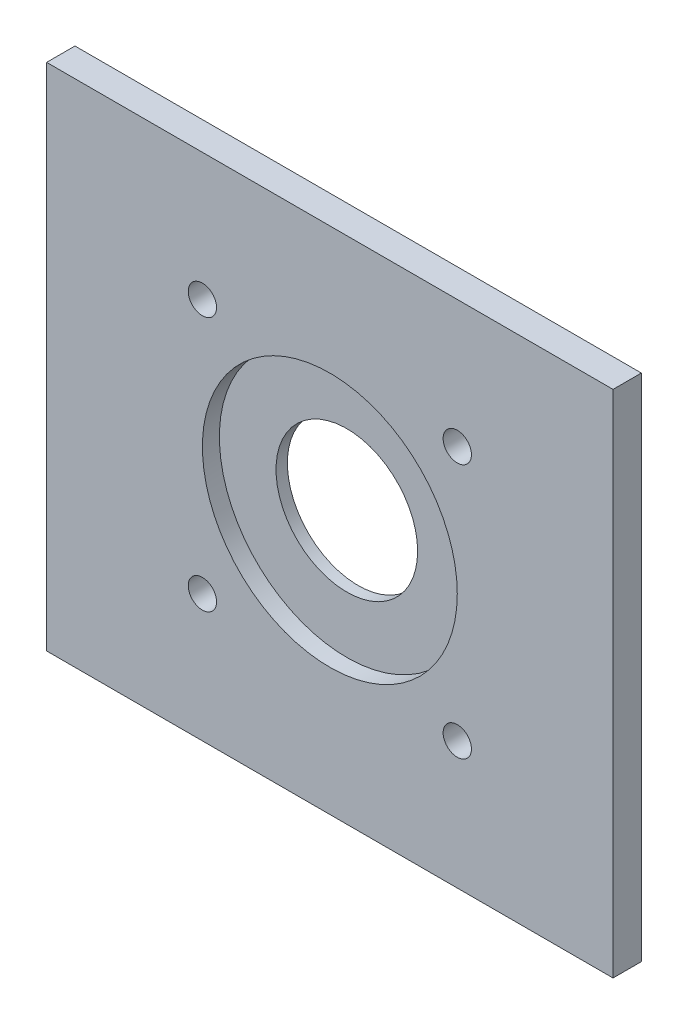
ISO-10303-21;
HEADER;
FILE_DESCRIPTION(('STEP AP214'),'2;1');
FILE_NAME('part.step','',(''),(''),'','','');
FILE_SCHEMA(('AUTOMOTIVE_DESIGN { 1 0 10303 214 1 1 1 1 }'));
ENDSEC;
DATA;
#1=APPLICATION_CONTEXT('core data for automotive mechanical design processes');
#2=APPLICATION_PROTOCOL_DEFINITION('international standard','automotive_design',2000,#1);
#3=PRODUCT_CONTEXT('',#1,'mechanical');
#4=PRODUCT('Part','Part','',(#3));
#5=PRODUCT_RELATED_PRODUCT_CATEGORY('part','',(#4));
#6=PRODUCT_DEFINITION_FORMATION('','',#4);
#7=PRODUCT_DEFINITION_CONTEXT('part definition',#1,'design');
#8=PRODUCT_DEFINITION('design','',#6,#7);
#9=PRODUCT_DEFINITION_SHAPE('','',#8);
#10=(LENGTH_UNIT() NAMED_UNIT(*) SI_UNIT(.MILLI.,.METRE.));
#11=(NAMED_UNIT(*) PLANE_ANGLE_UNIT() SI_UNIT($,.RADIAN.));
#12=(NAMED_UNIT(*) SI_UNIT($,.STERADIAN.) SOLID_ANGLE_UNIT());
#13=UNCERTAINTY_MEASURE_WITH_UNIT(LENGTH_MEASURE(1.E-05),#10,'distance_accuracy_value','');
#14=(GEOMETRIC_REPRESENTATION_CONTEXT(3) GLOBAL_UNCERTAINTY_ASSIGNED_CONTEXT((#13)) GLOBAL_UNIT_ASSIGNED_CONTEXT((#10,
#11,#12)) REPRESENTATION_CONTEXT('',''));
#15=CARTESIAN_POINT('',(0.,0.,0.));
#16=DIRECTION('',(0.,0.,1.));
#17=DIRECTION('',(1.,0.,0.));
#18=AXIS2_PLACEMENT_3D('',#15,#16,#17);
#19=CARTESIAN_POINT('',(50.,45.,5.));
#20=DIRECTION('',(0.,0.,-1.));
#21=DIRECTION('',(-1.,0.,0.));
#22=AXIS2_PLACEMENT_3D('',#19,#20,#21);
#23=CYLINDRICAL_SURFACE('',#22,12.5);
#24=CARTESIAN_POINT('',(50.,45.,0.));
#25=DIRECTION('',(0.,0.,1.));
#26=DIRECTION('',(1.,0.,0.));
#27=AXIS2_PLACEMENT_3D('',#24,#25,#26);
#28=CIRCLE('',#27,12.5);
#29=CARTESIAN_POINT('',(62.5,45.,0.));
#30=VERTEX_POINT('',#29);
#31=EDGE_CURVE('E140',#30,#30,#28,.T.);
#32=ORIENTED_EDGE('',*,*,#31,.F.);
#33=EDGE_LOOP('',(#32));
#34=FACE_BOUND('',#33,.T.);
#35=CARTESIAN_POINT('',(50.,45.,2.));
#36=DIRECTION('',(0.,0.,1.));
#37=DIRECTION('',(1.,0.,0.));
#38=AXIS2_PLACEMENT_3D('',#35,#36,#37);
#39=CIRCLE('',#38,12.5);
#40=CARTESIAN_POINT('',(62.5,45.,2.));
#41=VERTEX_POINT('',#40);
#42=EDGE_CURVE('E41',#41,#41,#39,.T.);
#43=ORIENTED_EDGE('',*,*,#42,.T.);
#44=EDGE_LOOP('',(#43));
#45=FACE_BOUND('',#44,.T.);
#46=ADVANCED_FACE('F37',(#34,#45),#23,.F.);
#47=CARTESIAN_POINT('',(0.,0.,5.));
#48=DIRECTION('',(0.,0.,-1.));
#49=DIRECTION('',(-1.,0.,0.));
#50=AXIS2_PLACEMENT_3D('',#47,#48,#49);
#51=PLANE('',#50);
#52=CARTESIAN_POINT('',(50.,45.,5.));
#53=DIRECTION('',(0.,0.,1.));
#54=DIRECTION('',(1.,0.,0.));
#55=AXIS2_PLACEMENT_3D('',#52,#53,#54);
#56=CIRCLE('',#55,22.5);
#57=CARTESIAN_POINT('',(72.5,45.,5.));
#58=VERTEX_POINT('',#57);
#59=EDGE_CURVE('E145',#58,#58,#56,.T.);
#60=ORIENTED_EDGE('',*,*,#59,.F.);
#61=EDGE_LOOP('',(#60));
#62=FACE_BOUND('',#61,.T.);
#63=DIRECTION('',(0.,-1.,0.));
#64=VECTOR('',#63,1.);
#65=CARTESIAN_POINT('',(0.,0.,5.));
#66=LINE('',#65,#64);
#67=CARTESIAN_POINT('',(0.,90.,5.));
#68=VERTEX_POINT('',#67);
#69=CARTESIAN_POINT('',(0.,0.,5.));
#70=VERTEX_POINT('',#69);
#71=EDGE_CURVE('E91',#68,#70,#66,.T.);
#72=ORIENTED_EDGE('',*,*,#71,.T.);
#73=DIRECTION('',(1.,0.,0.));
#74=VECTOR('',#73,1.);
#75=CARTESIAN_POINT('',(0.,0.,5.));
#76=LINE('',#75,#74);
#77=CARTESIAN_POINT('',(100.,0.,5.));
#78=VERTEX_POINT('',#77);
#79=EDGE_CURVE('E85',#70,#78,#76,.T.);
#80=ORIENTED_EDGE('',*,*,#79,.T.);
#81=DIRECTION('',(0.,1.,0.));
#82=VECTOR('',#81,1.);
#83=CARTESIAN_POINT('',(100.,0.,5.));
#84=LINE('',#83,#82);
#85=CARTESIAN_POINT('',(100.,90.,5.));
#86=VERTEX_POINT('',#85);
#87=EDGE_CURVE('E89',#78,#86,#84,.T.);
#88=ORIENTED_EDGE('',*,*,#87,.T.);
#89=DIRECTION('',(-1.,0.,0.));
#90=VECTOR('',#89,1.);
#91=CARTESIAN_POINT('',(0.,90.,5.));
#92=LINE('',#91,#90);
#93=EDGE_CURVE('E55',#86,#68,#92,.T.);
#94=ORIENTED_EDGE('',*,*,#93,.T.);
#95=EDGE_LOOP('',(#72,#80,#88,#94));
#96=FACE_BOUND('',#95,.T.);
#97=CARTESIAN_POINT('',(27.5,67.5,5.));
#98=DIRECTION('',(0.,0.,1.));
#99=DIRECTION('',(1.,0.,0.));
#100=AXIS2_PLACEMENT_3D('',#97,#98,#99);
#101=CIRCLE('',#100,2.5);
#102=CARTESIAN_POINT('',(30.,67.5,5.));
#103=VERTEX_POINT('',#102);
#104=EDGE_CURVE('E107',#103,#103,#101,.T.);
#105=ORIENTED_EDGE('',*,*,#104,.F.);
#106=EDGE_LOOP('',(#105));
#107=FACE_BOUND('',#106,.T.);
#108=CARTESIAN_POINT('',(72.5,67.5,5.));
#109=DIRECTION('',(0.,0.,1.));
#110=DIRECTION('',(1.,0.,0.));
#111=AXIS2_PLACEMENT_3D('',#108,#109,#110);
#112=CIRCLE('',#111,2.50000000000001);
#113=CARTESIAN_POINT('',(75.,67.5,5.));
#114=VERTEX_POINT('',#113);
#115=EDGE_CURVE('E122',#114,#114,#112,.T.);
#116=ORIENTED_EDGE('',*,*,#115,.F.);
#117=EDGE_LOOP('',(#116));
#118=FACE_BOUND('',#117,.T.);
#119=CARTESIAN_POINT('',(72.5,22.5,5.));
#120=DIRECTION('',(0.,0.,1.));
#121=DIRECTION('',(1.,0.,0.));
#122=AXIS2_PLACEMENT_3D('',#119,#120,#121);
#123=CIRCLE('',#122,2.50000000000001);
#124=CARTESIAN_POINT('',(75.,22.5,5.));
#125=VERTEX_POINT('',#124);
#126=EDGE_CURVE('E128',#125,#125,#123,.T.);
#127=ORIENTED_EDGE('',*,*,#126,.F.);
#128=EDGE_LOOP('',(#127));
#129=FACE_BOUND('',#128,.T.);
#130=CARTESIAN_POINT('',(27.5,22.5,5.));
#131=DIRECTION('',(0.,0.,1.));
#132=DIRECTION('',(1.,0.,0.));
#133=AXIS2_PLACEMENT_3D('',#130,#131,#132);
#134=CIRCLE('',#133,2.5);
#135=CARTESIAN_POINT('',(30.,22.5,5.));
#136=VERTEX_POINT('',#135);
#137=EDGE_CURVE('E134',#136,#136,#134,.T.);
#138=ORIENTED_EDGE('',*,*,#137,.F.);
#139=EDGE_LOOP('',(#138));
#140=FACE_BOUND('',#139,.T.);
#141=ADVANCED_FACE('F86',(#62,#96,#107,#118,#129,#140),#51,.F.);
#142=CARTESIAN_POINT('',(0.,0.,0.));
#143=DIRECTION('',(0.,0.,-1.));
#144=DIRECTION('',(-1.,0.,0.));
#145=AXIS2_PLACEMENT_3D('',#142,#143,#144);
#146=PLANE('',#145);
#147=CARTESIAN_POINT('',(27.5,22.5,0.));
#148=DIRECTION('',(0.,0.,1.));
#149=DIRECTION('',(1.,0.,0.));
#150=AXIS2_PLACEMENT_3D('',#147,#148,#149);
#151=CIRCLE('',#150,2.5);
#152=CARTESIAN_POINT('',(30.,22.5,0.));
#153=VERTEX_POINT('',#152);
#154=EDGE_CURVE('E137',#153,#153,#151,.T.);
#155=ORIENTED_EDGE('',*,*,#154,.T.);
#156=EDGE_LOOP('',(#155));
#157=FACE_BOUND('',#156,.T.);
#158=CARTESIAN_POINT('',(72.5,67.5,0.));
#159=DIRECTION('',(0.,0.,1.));
#160=DIRECTION('',(1.,0.,0.));
#161=AXIS2_PLACEMENT_3D('',#158,#159,#160);
#162=CIRCLE('',#161,2.50000000000001);
#163=CARTESIAN_POINT('',(75.,67.5,0.));
#164=VERTEX_POINT('',#163);
#165=EDGE_CURVE('E125',#164,#164,#162,.T.);
#166=ORIENTED_EDGE('',*,*,#165,.T.);
#167=EDGE_LOOP('',(#166));
#168=FACE_BOUND('',#167,.T.);
#169=DIRECTION('',(0.,-1.,0.));
#170=VECTOR('',#169,1.);
#171=CARTESIAN_POINT('',(0.,0.,0.));
#172=LINE('',#171,#170);
#173=CARTESIAN_POINT('',(0.,90.,0.));
#174=VERTEX_POINT('',#173);
#175=CARTESIAN_POINT('',(0.,0.,0.));
#176=VERTEX_POINT('',#175);
#177=EDGE_CURVE('E104',#174,#176,#172,.T.);
#178=ORIENTED_EDGE('',*,*,#177,.F.);
#179=DIRECTION('',(-1.,0.,0.));
#180=VECTOR('',#179,1.);
#181=CARTESIAN_POINT('',(0.,90.,0.));
#182=LINE('',#181,#180);
#183=CARTESIAN_POINT('',(100.,90.,0.));
#184=VERTEX_POINT('',#183);
#185=EDGE_CURVE('E78',#184,#174,#182,.T.);
#186=ORIENTED_EDGE('',*,*,#185,.F.);
#187=DIRECTION('',(0.,1.,0.));
#188=VECTOR('',#187,1.);
#189=CARTESIAN_POINT('',(100.,0.,0.));
#190=LINE('',#189,#188);
#191=CARTESIAN_POINT('',(100.,0.,0.));
#192=VERTEX_POINT('',#191);
#193=EDGE_CURVE('E72',#192,#184,#190,.T.);
#194=ORIENTED_EDGE('',*,*,#193,.F.);
#195=DIRECTION('',(1.,0.,0.));
#196=VECTOR('',#195,1.);
#197=CARTESIAN_POINT('',(0.,0.,0.));
#198=LINE('',#197,#196);
#199=EDGE_CURVE('E95',#176,#192,#198,.T.);
#200=ORIENTED_EDGE('',*,*,#199,.F.);
#201=EDGE_LOOP('',(#178,#186,#194,#200));
#202=FACE_BOUND('',#201,.T.);
#203=CARTESIAN_POINT('',(27.5,67.5,0.));
#204=DIRECTION('',(0.,0.,1.));
#205=DIRECTION('',(1.,0.,0.));
#206=AXIS2_PLACEMENT_3D('',#203,#204,#205);
#207=CIRCLE('',#206,2.5);
#208=CARTESIAN_POINT('',(30.,67.5,0.));
#209=VERTEX_POINT('',#208);
#210=EDGE_CURVE('E119',#209,#209,#207,.T.);
#211=ORIENTED_EDGE('',*,*,#210,.T.);
#212=EDGE_LOOP('',(#211));
#213=FACE_BOUND('',#212,.T.);
#214=CARTESIAN_POINT('',(72.5,22.5,0.));
#215=DIRECTION('',(0.,0.,1.));
#216=DIRECTION('',(1.,0.,0.));
#217=AXIS2_PLACEMENT_3D('',#214,#215,#216);
#218=CIRCLE('',#217,2.50000000000001);
#219=CARTESIAN_POINT('',(75.,22.5,0.));
#220=VERTEX_POINT('',#219);
#221=EDGE_CURVE('E131',#220,#220,#218,.T.);
#222=ORIENTED_EDGE('',*,*,#221,.T.);
#223=EDGE_LOOP('',(#222));
#224=FACE_BOUND('',#223,.T.);
#225=ORIENTED_EDGE('',*,*,#31,.T.);
#226=EDGE_LOOP('',(#225));
#227=FACE_BOUND('',#226,.T.);
#228=ADVANCED_FACE('F115',(#157,#168,#202,#213,#224,#227),#146,.T.);
#229=CARTESIAN_POINT('',(0.,0.,5.));
#230=DIRECTION('',(1.,0.,0.));
#231=DIRECTION('',(0.,0.,-1.));
#232=AXIS2_PLACEMENT_3D('',#229,#230,#231);
#233=PLANE('',#232);
#234=ORIENTED_EDGE('',*,*,#177,.T.);
#235=DIRECTION('',(0.,0.,-1.));
#236=VECTOR('',#235,1.);
#237=CARTESIAN_POINT('',(0.,0.,5.));
#238=LINE('',#237,#236);
#239=EDGE_CURVE('E11',#70,#176,#238,.T.);
#240=ORIENTED_EDGE('',*,*,#239,.F.);
#241=ORIENTED_EDGE('',*,*,#71,.F.);
#242=DIRECTION('',(0.,0.,-1.));
#243=VECTOR('',#242,1.);
#244=CARTESIAN_POINT('',(0.,90.,5.));
#245=LINE('',#244,#243);
#246=EDGE_CURVE('E100',#68,#174,#245,.T.);
#247=ORIENTED_EDGE('',*,*,#246,.T.);
#248=EDGE_LOOP('',(#234,#240,#241,#247));
#249=FACE_BOUND('',#248,.T.);
#250=ADVANCED_FACE('F39',(#249),#233,.F.);
#251=CARTESIAN_POINT('',(0.,0.,5.));
#252=DIRECTION('',(0.,1.,0.));
#253=DIRECTION('',(0.,0.,1.));
#254=AXIS2_PLACEMENT_3D('',#251,#252,#253);
#255=PLANE('',#254);
#256=ORIENTED_EDGE('',*,*,#199,.T.);
#257=DIRECTION('',(0.,0.,-1.));
#258=VECTOR('',#257,1.);
#259=CARTESIAN_POINT('',(100.,0.,5.));
#260=LINE('',#259,#258);
#261=EDGE_CURVE('E47',#78,#192,#260,.T.);
#262=ORIENTED_EDGE('',*,*,#261,.F.);
#263=ORIENTED_EDGE('',*,*,#79,.F.);
#264=ORIENTED_EDGE('',*,*,#239,.T.);
#265=EDGE_LOOP('',(#256,#262,#263,#264));
#266=FACE_BOUND('',#265,.T.);
#267=ADVANCED_FACE('F94',(#266),#255,.F.);
#268=CARTESIAN_POINT('',(100.,0.,5.));
#269=DIRECTION('',(-1.,0.,0.));
#270=DIRECTION('',(0.,0.,1.));
#271=AXIS2_PLACEMENT_3D('',#268,#269,#270);
#272=PLANE('',#271);
#273=ORIENTED_EDGE('',*,*,#193,.T.);
#274=DIRECTION('',(0.,0.,-1.));
#275=VECTOR('',#274,1.);
#276=CARTESIAN_POINT('',(100.,90.,5.));
#277=LINE('',#276,#275);
#278=EDGE_CURVE('E96',#86,#184,#277,.T.);
#279=ORIENTED_EDGE('',*,*,#278,.F.);
#280=ORIENTED_EDGE('',*,*,#87,.F.);
#281=ORIENTED_EDGE('',*,*,#261,.T.);
#282=EDGE_LOOP('',(#273,#279,#280,#281));
#283=FACE_BOUND('',#282,.T.);
#284=ADVANCED_FACE('F98',(#283),#272,.F.);
#285=CARTESIAN_POINT('',(0.,90.,5.));
#286=DIRECTION('',(0.,-1.,0.));
#287=DIRECTION('',(0.,0.,-1.));
#288=AXIS2_PLACEMENT_3D('',#285,#286,#287);
#289=PLANE('',#288);
#290=ORIENTED_EDGE('',*,*,#185,.T.);
#291=ORIENTED_EDGE('',*,*,#246,.F.);
#292=ORIENTED_EDGE('',*,*,#93,.F.);
#293=ORIENTED_EDGE('',*,*,#278,.T.);
#294=EDGE_LOOP('',(#290,#291,#292,#293));
#295=FACE_BOUND('',#294,.T.);
#296=ADVANCED_FACE('F112',(#295),#289,.F.);
#297=CARTESIAN_POINT('',(27.5,67.5,5.));
#298=DIRECTION('',(0.,0.,-1.));
#299=DIRECTION('',(-1.,0.,0.));
#300=AXIS2_PLACEMENT_3D('',#297,#298,#299);
#301=CYLINDRICAL_SURFACE('',#300,2.5);
#302=ORIENTED_EDGE('',*,*,#104,.T.);
#303=EDGE_LOOP('',(#302));
#304=FACE_BOUND('',#303,.T.);
#305=ORIENTED_EDGE('',*,*,#210,.F.);
#306=EDGE_LOOP('',(#305));
#307=FACE_BOUND('',#306,.T.);
#308=ADVANCED_FACE('F186',(#304,#307),#301,.F.);
#309=CARTESIAN_POINT('',(72.5,67.5,5.));
#310=DIRECTION('',(0.,0.,-1.));
#311=DIRECTION('',(-1.,0.,0.));
#312=AXIS2_PLACEMENT_3D('',#309,#310,#311);
#313=CYLINDRICAL_SURFACE('',#312,2.50000000000001);
#314=ORIENTED_EDGE('',*,*,#115,.T.);
#315=EDGE_LOOP('',(#314));
#316=FACE_BOUND('',#315,.T.);
#317=ORIENTED_EDGE('',*,*,#165,.F.);
#318=EDGE_LOOP('',(#317));
#319=FACE_BOUND('',#318,.T.);
#320=ADVANCED_FACE('F182',(#316,#319),#313,.F.);
#321=CARTESIAN_POINT('',(72.5,22.5,5.));
#322=DIRECTION('',(0.,0.,-1.));
#323=DIRECTION('',(-1.,0.,0.));
#324=AXIS2_PLACEMENT_3D('',#321,#322,#323);
#325=CYLINDRICAL_SURFACE('',#324,2.50000000000001);
#326=ORIENTED_EDGE('',*,*,#126,.T.);
#327=EDGE_LOOP('',(#326));
#328=FACE_BOUND('',#327,.T.);
#329=ORIENTED_EDGE('',*,*,#221,.F.);
#330=EDGE_LOOP('',(#329));
#331=FACE_BOUND('',#330,.T.);
#332=ADVANCED_FACE('F178',(#328,#331),#325,.F.);
#333=CARTESIAN_POINT('',(27.5,22.5,5.));
#334=DIRECTION('',(0.,0.,-1.));
#335=DIRECTION('',(-1.,0.,0.));
#336=AXIS2_PLACEMENT_3D('',#333,#334,#335);
#337=CYLINDRICAL_SURFACE('',#336,2.5);
#338=ORIENTED_EDGE('',*,*,#137,.T.);
#339=EDGE_LOOP('',(#338));
#340=FACE_BOUND('',#339,.T.);
#341=ORIENTED_EDGE('',*,*,#154,.F.);
#342=EDGE_LOOP('',(#341));
#343=FACE_BOUND('',#342,.T.);
#344=ADVANCED_FACE('F163',(#340,#343),#337,.F.);
#345=CARTESIAN_POINT('',(50.,45.,2.));
#346=DIRECTION('',(0.,0.,1.));
#347=DIRECTION('',(1.,0.,0.));
#348=AXIS2_PLACEMENT_3D('',#345,#346,#347);
#349=CYLINDRICAL_SURFACE('',#348,22.5);
#350=CARTESIAN_POINT('',(50.,45.,2.));
#351=DIRECTION('',(0.,0.,1.));
#352=DIRECTION('',(1.,0.,0.));
#353=AXIS2_PLACEMENT_3D('',#350,#351,#352);
#354=CIRCLE('',#353,22.5);
#355=CARTESIAN_POINT('',(72.5,45.,2.));
#356=VERTEX_POINT('',#355);
#357=EDGE_CURVE('E148',#356,#356,#354,.T.);
#358=ORIENTED_EDGE('',*,*,#357,.F.);
#359=EDGE_LOOP('',(#358));
#360=FACE_BOUND('',#359,.T.);
#361=ORIENTED_EDGE('',*,*,#59,.T.);
#362=EDGE_LOOP('',(#361));
#363=FACE_BOUND('',#362,.T.);
#364=ADVANCED_FACE('F158',(#360,#363),#349,.F.);
#365=CARTESIAN_POINT('',(50.,45.,2.));
#366=DIRECTION('',(0.,0.,1.));
#367=DIRECTION('',(1.,0.,0.));
#368=AXIS2_PLACEMENT_3D('',#365,#366,#367);
#369=PLANE('',#368);
#370=ORIENTED_EDGE('',*,*,#42,.F.);
#371=EDGE_LOOP('',(#370));
#372=FACE_BOUND('',#371,.T.);
#373=ORIENTED_EDGE('',*,*,#357,.T.);
#374=EDGE_LOOP('',(#373));
#375=FACE_BOUND('',#374,.T.);
#376=ADVANCED_FACE('F156',(#372,#375),#369,.T.);
#377=CLOSED_SHELL('',(#46,#141,#228,#250,#267,#284,#296,#308,#320,#332,#344,#364,#376));
#378=MANIFOLD_SOLID_BREP('B2',#377);
#379=ADVANCED_BREP_SHAPE_REPRESENTATION('',(#18,#378),#14);
#380=SHAPE_DEFINITION_REPRESENTATION(#9,#379);
ENDSEC;
END-ISO-10303-21;
